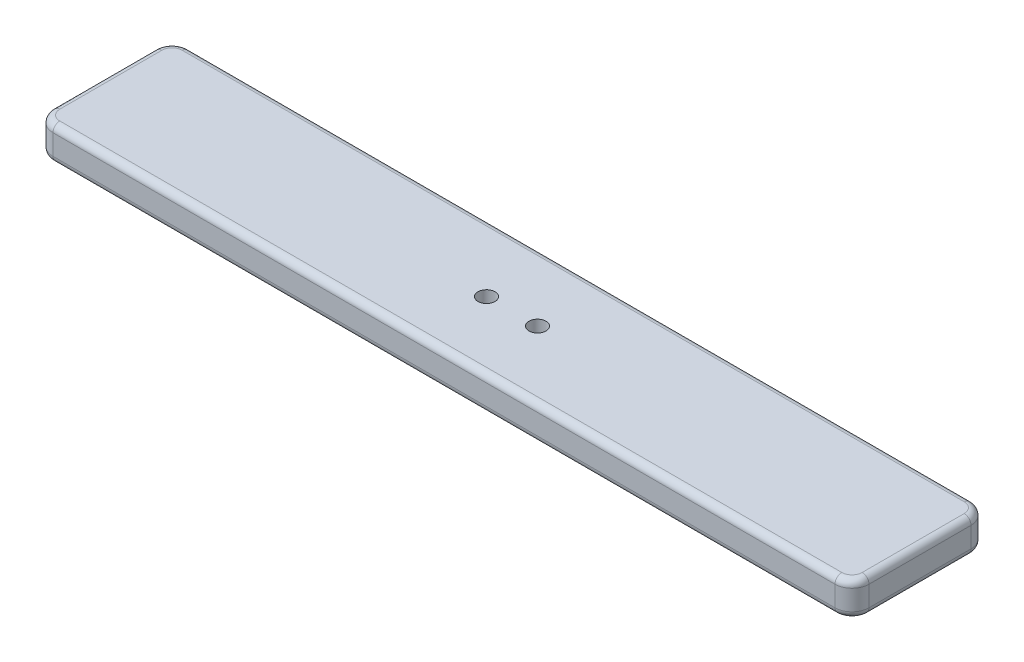
ISO-10303-21;
HEADER;
FILE_DESCRIPTION(('STEP AP214'),'2;1');
FILE_NAME('part.step','',(''),(''),'','','');
FILE_SCHEMA(('AUTOMOTIVE_DESIGN { 1 0 10303 214 1 1 1 1 }'));
ENDSEC;
DATA;
#1=APPLICATION_CONTEXT('core data for automotive mechanical design processes');
#2=APPLICATION_PROTOCOL_DEFINITION('international standard','automotive_design',2000,#1);
#3=PRODUCT_CONTEXT('',#1,'mechanical');
#4=PRODUCT('Part','Part','',(#3));
#5=PRODUCT_RELATED_PRODUCT_CATEGORY('part','',(#4));
#6=PRODUCT_DEFINITION_FORMATION('','',#4);
#7=PRODUCT_DEFINITION_CONTEXT('part definition',#1,'design');
#8=PRODUCT_DEFINITION('design','',#6,#7);
#9=PRODUCT_DEFINITION_SHAPE('','',#8);
#10=(LENGTH_UNIT() NAMED_UNIT(*) SI_UNIT(.MILLI.,.METRE.));
#11=(NAMED_UNIT(*) PLANE_ANGLE_UNIT() SI_UNIT($,.RADIAN.));
#12=(NAMED_UNIT(*) SI_UNIT($,.STERADIAN.) SOLID_ANGLE_UNIT());
#13=UNCERTAINTY_MEASURE_WITH_UNIT(LENGTH_MEASURE(1.E-05),#10,'distance_accuracy_value','');
#14=(GEOMETRIC_REPRESENTATION_CONTEXT(3) GLOBAL_UNCERTAINTY_ASSIGNED_CONTEXT((#13)) GLOBAL_UNIT_ASSIGNED_CONTEXT((#10,
#11,#12)) REPRESENTATION_CONTEXT('',''));
#15=CARTESIAN_POINT('',(0.,0.,0.));
#16=DIRECTION('',(0.,0.,1.));
#17=DIRECTION('',(1.,0.,0.));
#18=AXIS2_PLACEMENT_3D('',#15,#16,#17);
#19=CARTESIAN_POINT('',(0.,12.7,0.));
#20=DIRECTION('',(1.,0.,0.));
#21=DIRECTION('',(0.,0.,-1.));
#22=AXIS2_PLACEMENT_3D('',#19,#20,#21);
#23=PLANE('',#22);
#24=DIRECTION('',(0.,-1.,0.));
#25=VECTOR('',#24,1.);
#26=CARTESIAN_POINT('',(0.,12.7,-44.45));
#27=LINE('',#26,#25);
#28=CARTESIAN_POINT('',(0.,10.16,-44.45));
#29=VERTEX_POINT('',#28);
#30=CARTESIAN_POINT('',(0.,2.54,-44.45));
#31=VERTEX_POINT('',#30);
#32=EDGE_CURVE('E167',#29,#31,#27,.T.);
#33=ORIENTED_EDGE('',*,*,#32,.T.);
#34=DIRECTION('',(0.,0.,1.));
#35=VECTOR('',#34,1.);
#36=CARTESIAN_POINT('',(0.,2.54,-6.35));
#37=LINE('',#36,#35);
#38=CARTESIAN_POINT('',(0.,2.54,-6.35));
#39=VERTEX_POINT('',#38);
#40=EDGE_CURVE('E183',#31,#39,#37,.T.);
#41=ORIENTED_EDGE('',*,*,#40,.T.);
#42=DIRECTION('',(0.,-1.,0.));
#43=VECTOR('',#42,1.);
#44=CARTESIAN_POINT('',(0.,12.7,-6.35));
#45=LINE('',#44,#43);
#46=CARTESIAN_POINT('',(0.,10.16,-6.35));
#47=VERTEX_POINT('',#46);
#48=EDGE_CURVE('E301',#39,#47,#45,.F.);
#49=ORIENTED_EDGE('',*,*,#48,.T.);
#50=DIRECTION('',(0.,0.,1.));
#51=VECTOR('',#50,1.);
#52=CARTESIAN_POINT('',(0.,10.16,0.));
#53=LINE('',#52,#51);
#54=EDGE_CURVE('E181',#47,#29,#53,.F.);
#55=ORIENTED_EDGE('',*,*,#54,.T.);
#56=EDGE_LOOP('',(#33,#41,#49,#55));
#57=FACE_BOUND('',#56,.T.);
#58=ADVANCED_FACE('F34',(#57),#23,.F.);
#59=CARTESIAN_POINT('',(0.,12.7,0.));
#60=DIRECTION('',(0.,0.,-1.));
#61=DIRECTION('',(-1.,0.,0.));
#62=AXIS2_PLACEMENT_3D('',#59,#60,#61);
#63=PLANE('',#62);
#64=DIRECTION('',(0.,-1.,0.));
#65=VECTOR('',#64,1.);
#66=CARTESIAN_POINT('',(6.35,12.7,0.));
#67=LINE('',#66,#65);
#68=CARTESIAN_POINT('',(6.35,10.16,0.));
#69=VERTEX_POINT('',#68);
#70=CARTESIAN_POINT('',(6.35,2.54,0.));
#71=VERTEX_POINT('',#70);
#72=EDGE_CURVE('E295',#69,#71,#67,.T.);
#73=ORIENTED_EDGE('',*,*,#72,.T.);
#74=DIRECTION('',(1.,0.,0.));
#75=VECTOR('',#74,1.);
#76=CARTESIAN_POINT('',(298.45,2.54,0.));
#77=LINE('',#76,#75);
#78=CARTESIAN_POINT('',(298.45,2.54,0.));
#79=VERTEX_POINT('',#78);
#80=EDGE_CURVE('E191',#71,#79,#77,.T.);
#81=ORIENTED_EDGE('',*,*,#80,.T.);
#82=DIRECTION('',(0.,-1.,0.));
#83=VECTOR('',#82,1.);
#84=CARTESIAN_POINT('',(298.45,12.7,0.));
#85=LINE('',#84,#83);
#86=CARTESIAN_POINT('',(298.45,10.16,0.));
#87=VERTEX_POINT('',#86);
#88=EDGE_CURVE('E298',#79,#87,#85,.F.);
#89=ORIENTED_EDGE('',*,*,#88,.T.);
#90=DIRECTION('',(1.,0.,0.));
#91=VECTOR('',#90,1.);
#92=CARTESIAN_POINT('',(0.,10.16,0.));
#93=LINE('',#92,#91);
#94=EDGE_CURVE('E189',#87,#69,#93,.F.);
#95=ORIENTED_EDGE('',*,*,#94,.T.);
#96=EDGE_LOOP('',(#73,#81,#89,#95));
#97=FACE_BOUND('',#96,.T.);
#98=ADVANCED_FACE('F366',(#97),#63,.F.);
#99=CARTESIAN_POINT('',(304.8,12.7,0.));
#100=DIRECTION('',(-1.,0.,0.));
#101=DIRECTION('',(0.,0.,1.));
#102=AXIS2_PLACEMENT_3D('',#99,#100,#101);
#103=PLANE('',#102);
#104=DIRECTION('',(0.,-1.,0.));
#105=VECTOR('',#104,1.);
#106=CARTESIAN_POINT('',(304.8,12.7,-6.35));
#107=LINE('',#106,#105);
#108=CARTESIAN_POINT('',(304.8,10.16,-6.35));
#109=VERTEX_POINT('',#108);
#110=CARTESIAN_POINT('',(304.8,2.54,-6.35));
#111=VERTEX_POINT('',#110);
#112=EDGE_CURVE('E284',#109,#111,#107,.T.);
#113=ORIENTED_EDGE('',*,*,#112,.T.);
#114=DIRECTION('',(0.,0.,-1.));
#115=VECTOR('',#114,1.);
#116=CARTESIAN_POINT('',(304.8,2.54,-44.45));
#117=LINE('',#116,#115);
#118=CARTESIAN_POINT('',(304.8,2.54,-44.45));
#119=VERTEX_POINT('',#118);
#120=EDGE_CURVE('E200',#111,#119,#117,.T.);
#121=ORIENTED_EDGE('',*,*,#120,.T.);
#122=DIRECTION('',(0.,-1.,0.));
#123=VECTOR('',#122,1.);
#124=CARTESIAN_POINT('',(304.8,12.7,-44.45));
#125=LINE('',#124,#123);
#126=CARTESIAN_POINT('',(304.8,10.16,-44.45));
#127=VERTEX_POINT('',#126);
#128=EDGE_CURVE('E292',#119,#127,#125,.F.);
#129=ORIENTED_EDGE('',*,*,#128,.T.);
#130=DIRECTION('',(0.,0.,-1.));
#131=VECTOR('',#130,1.);
#132=CARTESIAN_POINT('',(304.8,10.16,0.));
#133=LINE('',#132,#131);
#134=EDGE_CURVE('E198',#127,#109,#133,.F.);
#135=ORIENTED_EDGE('',*,*,#134,.T.);
#136=EDGE_LOOP('',(#113,#121,#129,#135));
#137=FACE_BOUND('',#136,.T.);
#138=ADVANCED_FACE('F350',(#137),#103,.F.);
#139=CARTESIAN_POINT('',(0.,12.7,-50.8));
#140=DIRECTION('',(0.,0.,1.));
#141=DIRECTION('',(1.,0.,0.));
#142=AXIS2_PLACEMENT_3D('',#139,#140,#141);
#143=PLANE('',#142);
#144=DIRECTION('',(0.,-1.,0.));
#145=VECTOR('',#144,1.);
#146=CARTESIAN_POINT('',(298.45,12.7,-50.8));
#147=LINE('',#146,#145);
#148=CARTESIAN_POINT('',(298.45,10.16,-50.8));
#149=VERTEX_POINT('',#148);
#150=CARTESIAN_POINT('',(298.45,2.54,-50.8));
#151=VERTEX_POINT('',#150);
#152=EDGE_CURVE('E282',#149,#151,#147,.T.);
#153=ORIENTED_EDGE('',*,*,#152,.T.);
#154=DIRECTION('',(-1.,0.,0.));
#155=VECTOR('',#154,1.);
#156=CARTESIAN_POINT('',(6.35,2.54,-50.8));
#157=LINE('',#156,#155);
#158=CARTESIAN_POINT('',(6.35,2.54,-50.8));
#159=VERTEX_POINT('',#158);
#160=EDGE_CURVE('E208',#151,#159,#157,.T.);
#161=ORIENTED_EDGE('',*,*,#160,.T.);
#162=DIRECTION('',(0.,-1.,0.));
#163=VECTOR('',#162,1.);
#164=CARTESIAN_POINT('',(6.35,12.7,-50.8));
#165=LINE('',#164,#163);
#166=CARTESIAN_POINT('',(6.35,10.16,-50.8));
#167=VERTEX_POINT('',#166);
#168=EDGE_CURVE('E239',#159,#167,#165,.F.);
#169=ORIENTED_EDGE('',*,*,#168,.T.);
#170=DIRECTION('',(-1.,0.,0.));
#171=VECTOR('',#170,1.);
#172=CARTESIAN_POINT('',(0.,10.16,-50.8));
#173=LINE('',#172,#171);
#174=EDGE_CURVE('E206',#167,#149,#173,.F.);
#175=ORIENTED_EDGE('',*,*,#174,.T.);
#176=EDGE_LOOP('',(#153,#161,#169,#175));
#177=FACE_BOUND('',#176,.T.);
#178=ADVANCED_FACE('F280',(#177),#143,.F.);
#179=CARTESIAN_POINT('',(0.,12.7,0.));
#180=DIRECTION('',(0.,-1.,0.));
#181=DIRECTION('',(0.,0.,-1.));
#182=AXIS2_PLACEMENT_3D('',#179,#180,#181);
#183=PLANE('',#182);
#184=CARTESIAN_POINT('',(161.925,12.7,-25.4));
#185=DIRECTION('',(0.,1.,0.));
#186=DIRECTION('',(0.,0.,-1.));
#187=AXIS2_PLACEMENT_3D('',#184,#185,#186);
#188=CIRCLE('',#187,3.175);
#189=CARTESIAN_POINT('',(161.925,12.7,-28.575));
#190=VERTEX_POINT('',#189);
#191=EDGE_CURVE('E624',#190,#190,#188,.T.);
#192=ORIENTED_EDGE('',*,*,#191,.F.);
#193=EDGE_LOOP('',(#192));
#194=FACE_BOUND('',#193,.T.);
#195=CARTESIAN_POINT('',(142.875,12.7,-25.4));
#196=DIRECTION('',(0.,1.,0.));
#197=DIRECTION('',(0.,0.,1.));
#198=AXIS2_PLACEMENT_3D('',#195,#196,#197);
#199=CIRCLE('',#198,3.175);
#200=CARTESIAN_POINT('',(142.875,12.7,-22.225));
#201=VERTEX_POINT('',#200);
#202=EDGE_CURVE('E287',#201,#201,#199,.T.);
#203=ORIENTED_EDGE('',*,*,#202,.F.);
#204=EDGE_LOOP('',(#203));
#205=FACE_BOUND('',#204,.T.);
#206=DIRECTION('',(1.,0.,0.));
#207=VECTOR('',#206,1.);
#208=CARTESIAN_POINT('',(0.,12.7,-2.54));
#209=LINE('',#208,#207);
#210=CARTESIAN_POINT('',(6.35,12.7,-2.54));
#211=VERTEX_POINT('',#210);
#212=CARTESIAN_POINT('',(298.45,12.7,-2.54));
#213=VERTEX_POINT('',#212);
#214=EDGE_CURVE('E43',#211,#213,#209,.T.);
#215=ORIENTED_EDGE('',*,*,#214,.T.);
#216=CARTESIAN_POINT('',(298.45,12.7,-6.35));
#217=DIRECTION('',(0.,-1.,0.));
#218=DIRECTION('',(0.,0.,-1.));
#219=AXIS2_PLACEMENT_3D('',#216,#217,#218);
#220=CIRCLE('',#219,3.81);
#221=CARTESIAN_POINT('',(302.26,12.7,-6.35));
#222=VERTEX_POINT('',#221);
#223=EDGE_CURVE('E11',#213,#222,#220,.F.);
#224=ORIENTED_EDGE('',*,*,#223,.T.);
#225=DIRECTION('',(0.,0.,-1.));
#226=VECTOR('',#225,1.);
#227=CARTESIAN_POINT('',(302.26,12.7,0.));
#228=LINE('',#227,#226);
#229=CARTESIAN_POINT('',(302.26,12.7,-44.45));
#230=VERTEX_POINT('',#229);
#231=EDGE_CURVE('E210',#222,#230,#228,.T.);
#232=ORIENTED_EDGE('',*,*,#231,.T.);
#233=CARTESIAN_POINT('',(298.45,12.7,-44.45));
#234=DIRECTION('',(0.,-1.,0.));
#235=DIRECTION('',(0.,0.,-1.));
#236=AXIS2_PLACEMENT_3D('',#233,#234,#235);
#237=CIRCLE('',#236,3.81);
#238=CARTESIAN_POINT('',(298.45,12.7,-48.26));
#239=VERTEX_POINT('',#238);
#240=EDGE_CURVE('E212',#230,#239,#237,.F.);
#241=ORIENTED_EDGE('',*,*,#240,.T.);
#242=DIRECTION('',(-1.,0.,0.));
#243=VECTOR('',#242,1.);
#244=CARTESIAN_POINT('',(0.,12.7,-48.26));
#245=LINE('',#244,#243);
#246=CARTESIAN_POINT('',(6.35,12.7,-48.26));
#247=VERTEX_POINT('',#246);
#248=EDGE_CURVE('E214',#239,#247,#245,.T.);
#249=ORIENTED_EDGE('',*,*,#248,.T.);
#250=CARTESIAN_POINT('',(6.35,12.7,-44.45));
#251=DIRECTION('',(0.,-1.,0.));
#252=DIRECTION('',(0.,0.,-1.));
#253=AXIS2_PLACEMENT_3D('',#250,#251,#252);
#254=CIRCLE('',#253,3.81);
#255=CARTESIAN_POINT('',(2.54,12.7,-44.45));
#256=VERTEX_POINT('',#255);
#257=EDGE_CURVE('E216',#247,#256,#254,.F.);
#258=ORIENTED_EDGE('',*,*,#257,.T.);
#259=DIRECTION('',(0.,0.,1.));
#260=VECTOR('',#259,1.);
#261=CARTESIAN_POINT('',(2.54,12.7,0.));
#262=LINE('',#261,#260);
#263=CARTESIAN_POINT('',(2.54,12.7,-6.35));
#264=VERTEX_POINT('',#263);
#265=EDGE_CURVE('E218',#256,#264,#262,.T.);
#266=ORIENTED_EDGE('',*,*,#265,.T.);
#267=CARTESIAN_POINT('',(6.35,12.7,-6.35));
#268=DIRECTION('',(0.,-1.,0.));
#269=DIRECTION('',(0.,0.,-1.));
#270=AXIS2_PLACEMENT_3D('',#267,#268,#269);
#271=CIRCLE('',#270,3.81);
#272=EDGE_CURVE('E54',#264,#211,#271,.F.);
#273=ORIENTED_EDGE('',*,*,#272,.T.);
#274=EDGE_LOOP('',(#215,#224,#232,#241,#249,#258,#266,#273));
#275=FACE_BOUND('',#274,.T.);
#276=ADVANCED_FACE('F338',(#194,#205,#275),#183,.F.);
#277=CARTESIAN_POINT('',(0.,0.,0.));
#278=DIRECTION('',(0.,-1.,0.));
#279=DIRECTION('',(0.,0.,-1.));
#280=AXIS2_PLACEMENT_3D('',#277,#278,#279);
#281=PLANE('',#280);
#282=CARTESIAN_POINT('',(161.925,0.,-25.4));
#283=DIRECTION('',(0.,1.,0.));
#284=DIRECTION('',(0.,0.,-1.));
#285=AXIS2_PLACEMENT_3D('',#282,#283,#284);
#286=CIRCLE('',#285,3.175);
#287=CARTESIAN_POINT('',(161.925,0.,-28.575));
#288=VERTEX_POINT('',#287);
#289=EDGE_CURVE('E621',#288,#288,#286,.T.);
#290=ORIENTED_EDGE('',*,*,#289,.T.);
#291=EDGE_LOOP('',(#290));
#292=FACE_BOUND('',#291,.T.);
#293=CARTESIAN_POINT('',(142.875,0.,-25.4));
#294=DIRECTION('',(0.,1.,0.));
#295=DIRECTION('',(0.,0.,1.));
#296=AXIS2_PLACEMENT_3D('',#293,#294,#295);
#297=CIRCLE('',#296,3.175);
#298=CARTESIAN_POINT('',(142.875,0.,-22.225));
#299=VERTEX_POINT('',#298);
#300=EDGE_CURVE('E243',#299,#299,#297,.T.);
#301=ORIENTED_EDGE('',*,*,#300,.T.);
#302=EDGE_LOOP('',(#301));
#303=FACE_BOUND('',#302,.T.);
#304=DIRECTION('',(0.,0.,1.));
#305=VECTOR('',#304,1.);
#306=CARTESIAN_POINT('',(2.54,0.,-44.45));
#307=LINE('',#306,#305);
#308=CARTESIAN_POINT('',(2.54,0.,-6.35));
#309=VERTEX_POINT('',#308);
#310=CARTESIAN_POINT('',(2.54,0.,-44.45));
#311=VERTEX_POINT('',#310);
#312=EDGE_CURVE('E171',#309,#311,#307,.F.);
#313=ORIENTED_EDGE('',*,*,#312,.T.);
#314=CARTESIAN_POINT('',(6.35,0.,-44.45));
#315=DIRECTION('',(0.,-1.,0.));
#316=DIRECTION('',(0.,0.,-1.));
#317=AXIS2_PLACEMENT_3D('',#314,#315,#316);
#318=CIRCLE('',#317,3.81);
#319=CARTESIAN_POINT('',(6.35,0.,-48.26));
#320=VERTEX_POINT('',#319);
#321=EDGE_CURVE('E152',#311,#320,#318,.T.);
#322=ORIENTED_EDGE('',*,*,#321,.T.);
#323=DIRECTION('',(-1.,0.,0.));
#324=VECTOR('',#323,1.);
#325=CARTESIAN_POINT('',(298.45,0.,-48.26));
#326=LINE('',#325,#324);
#327=CARTESIAN_POINT('',(298.45,0.,-48.26));
#328=VERTEX_POINT('',#327);
#329=EDGE_CURVE('E160',#320,#328,#326,.F.);
#330=ORIENTED_EDGE('',*,*,#329,.T.);
#331=CARTESIAN_POINT('',(298.45,0.,-44.45));
#332=DIRECTION('',(0.,-1.,0.));
#333=DIRECTION('',(0.,0.,-1.));
#334=AXIS2_PLACEMENT_3D('',#331,#332,#333);
#335=CIRCLE('',#334,3.81);
#336=CARTESIAN_POINT('',(302.26,0.,-44.45));
#337=VERTEX_POINT('',#336);
#338=EDGE_CURVE('E166',#328,#337,#335,.T.);
#339=ORIENTED_EDGE('',*,*,#338,.T.);
#340=DIRECTION('',(0.,0.,-1.));
#341=VECTOR('',#340,1.);
#342=CARTESIAN_POINT('',(302.26,0.,-6.35));
#343=LINE('',#342,#341);
#344=CARTESIAN_POINT('',(302.26,0.,-6.35));
#345=VERTEX_POINT('',#344);
#346=EDGE_CURVE('E306',#337,#345,#343,.F.);
#347=ORIENTED_EDGE('',*,*,#346,.T.);
#348=CARTESIAN_POINT('',(298.45,0.,-6.35));
#349=DIRECTION('',(0.,-1.,0.));
#350=DIRECTION('',(0.,0.,-1.));
#351=AXIS2_PLACEMENT_3D('',#348,#349,#350);
#352=CIRCLE('',#351,3.81);
#353=CARTESIAN_POINT('',(298.45,0.,-2.54));
#354=VERTEX_POINT('',#353);
#355=EDGE_CURVE('E308',#345,#354,#352,.T.);
#356=ORIENTED_EDGE('',*,*,#355,.T.);
#357=DIRECTION('',(1.,0.,0.));
#358=VECTOR('',#357,1.);
#359=CARTESIAN_POINT('',(6.35,0.,-2.54));
#360=LINE('',#359,#358);
#361=CARTESIAN_POINT('',(6.35,0.,-2.54));
#362=VERTEX_POINT('',#361);
#363=EDGE_CURVE('E310',#354,#362,#360,.F.);
#364=ORIENTED_EDGE('',*,*,#363,.T.);
#365=CARTESIAN_POINT('',(6.35,0.,-6.35));
#366=DIRECTION('',(0.,-1.,0.));
#367=DIRECTION('',(0.,0.,-1.));
#368=AXIS2_PLACEMENT_3D('',#365,#366,#367);
#369=CIRCLE('',#368,3.81);
#370=EDGE_CURVE('E176',#362,#309,#369,.T.);
#371=ORIENTED_EDGE('',*,*,#370,.T.);
#372=EDGE_LOOP('',(#313,#322,#330,#339,#347,#356,#364,#371));
#373=FACE_BOUND('',#372,.T.);
#374=ADVANCED_FACE('F169',(#292,#303,#373),#281,.T.);
#375=CARTESIAN_POINT('',(298.45,12.7,-44.45));
#376=DIRECTION('',(0.,-1.,0.));
#377=DIRECTION('',(0.,0.,-1.));
#378=AXIS2_PLACEMENT_3D('',#375,#376,#377);
#379=CYLINDRICAL_SURFACE('',#378,6.35);
#380=ORIENTED_EDGE('',*,*,#128,.F.);
#381=CARTESIAN_POINT('',(298.45,2.54,-44.45));
#382=DIRECTION('',(0.,-1.,0.));
#383=DIRECTION('',(0.,0.,-1.));
#384=AXIS2_PLACEMENT_3D('',#381,#382,#383);
#385=CIRCLE('',#384,6.35);
#386=EDGE_CURVE('E204',#119,#151,#385,.F.);
#387=ORIENTED_EDGE('',*,*,#386,.T.);
#388=ORIENTED_EDGE('',*,*,#152,.F.);
#389=CARTESIAN_POINT('',(298.45,10.16,-44.45));
#390=DIRECTION('',(0.,-1.,0.));
#391=DIRECTION('',(0.,0.,-1.));
#392=AXIS2_PLACEMENT_3D('',#389,#390,#391);
#393=CIRCLE('',#392,6.35);
#394=EDGE_CURVE('E202',#149,#127,#393,.T.);
#395=ORIENTED_EDGE('',*,*,#394,.T.);
#396=EDGE_LOOP('',(#380,#387,#388,#395));
#397=FACE_BOUND('',#396,.T.);
#398=ADVANCED_FACE('F377',(#397),#379,.T.);
#399=CARTESIAN_POINT('',(298.45,12.7,-6.35));
#400=DIRECTION('',(0.,-1.,0.));
#401=DIRECTION('',(0.,0.,-1.));
#402=AXIS2_PLACEMENT_3D('',#399,#400,#401);
#403=CYLINDRICAL_SURFACE('',#402,6.35);
#404=ORIENTED_EDGE('',*,*,#88,.F.);
#405=CARTESIAN_POINT('',(298.45,2.54,-6.35));
#406=DIRECTION('',(0.,-1.,0.));
#407=DIRECTION('',(0.,0.,-1.));
#408=AXIS2_PLACEMENT_3D('',#405,#406,#407);
#409=CIRCLE('',#408,6.35);
#410=EDGE_CURVE('E196',#79,#111,#409,.F.);
#411=ORIENTED_EDGE('',*,*,#410,.T.);
#412=ORIENTED_EDGE('',*,*,#112,.F.);
#413=CARTESIAN_POINT('',(298.45,10.16,-6.35));
#414=DIRECTION('',(0.,-1.,0.));
#415=DIRECTION('',(0.,0.,-1.));
#416=AXIS2_PLACEMENT_3D('',#413,#414,#415);
#417=CIRCLE('',#416,6.35);
#418=EDGE_CURVE('E193',#109,#87,#417,.T.);
#419=ORIENTED_EDGE('',*,*,#418,.T.);
#420=EDGE_LOOP('',(#404,#411,#412,#419));
#421=FACE_BOUND('',#420,.T.);
#422=ADVANCED_FACE('F355',(#421),#403,.T.);
#423=CARTESIAN_POINT('',(6.35,12.7,-44.45));
#424=DIRECTION('',(0.,-1.,0.));
#425=DIRECTION('',(0.,0.,-1.));
#426=AXIS2_PLACEMENT_3D('',#423,#424,#425);
#427=CYLINDRICAL_SURFACE('',#426,6.35);
#428=ORIENTED_EDGE('',*,*,#168,.F.);
#429=CARTESIAN_POINT('',(6.35,2.54,-44.45));
#430=DIRECTION('',(0.,-1.,0.));
#431=DIRECTION('',(0.,0.,-1.));
#432=AXIS2_PLACEMENT_3D('',#429,#430,#431);
#433=CIRCLE('',#432,6.35);
#434=EDGE_CURVE('E154',#159,#31,#433,.F.);
#435=ORIENTED_EDGE('',*,*,#434,.T.);
#436=ORIENTED_EDGE('',*,*,#32,.F.);
#437=CARTESIAN_POINT('',(6.35,10.16,-44.45));
#438=DIRECTION('',(0.,-1.,0.));
#439=DIRECTION('',(0.,0.,-1.));
#440=AXIS2_PLACEMENT_3D('',#437,#438,#439);
#441=CIRCLE('',#440,6.35);
#442=EDGE_CURVE('E173',#29,#167,#441,.T.);
#443=ORIENTED_EDGE('',*,*,#442,.T.);
#444=EDGE_LOOP('',(#428,#435,#436,#443));
#445=FACE_BOUND('',#444,.T.);
#446=ADVANCED_FACE('F276',(#445),#427,.T.);
#447=CARTESIAN_POINT('',(6.35,12.7,-6.35));
#448=DIRECTION('',(0.,-1.,0.));
#449=DIRECTION('',(0.,0.,-1.));
#450=AXIS2_PLACEMENT_3D('',#447,#448,#449);
#451=CYLINDRICAL_SURFACE('',#450,6.35);
#452=ORIENTED_EDGE('',*,*,#48,.F.);
#453=CARTESIAN_POINT('',(6.35,2.54,-6.35));
#454=DIRECTION('',(0.,-1.,0.));
#455=DIRECTION('',(0.,0.,-1.));
#456=AXIS2_PLACEMENT_3D('',#453,#454,#455);
#457=CIRCLE('',#456,6.35);
#458=EDGE_CURVE('E187',#39,#71,#457,.F.);
#459=ORIENTED_EDGE('',*,*,#458,.T.);
#460=ORIENTED_EDGE('',*,*,#72,.F.);
#461=CARTESIAN_POINT('',(6.35,10.16,-6.35));
#462=DIRECTION('',(0.,-1.,0.));
#463=DIRECTION('',(0.,0.,-1.));
#464=AXIS2_PLACEMENT_3D('',#461,#462,#463);
#465=CIRCLE('',#464,6.35);
#466=EDGE_CURVE('E185',#69,#47,#465,.T.);
#467=ORIENTED_EDGE('',*,*,#466,.T.);
#468=EDGE_LOOP('',(#452,#459,#460,#467));
#469=FACE_BOUND('',#468,.T.);
#470=ADVANCED_FACE('F324',(#469),#451,.T.);
#471=CARTESIAN_POINT('',(298.45,2.54,-6.35));
#472=DIRECTION('',(0.,-1.,0.));
#473=DIRECTION('',(0.,0.,-1.));
#474=AXIS2_PLACEMENT_3D('',#471,#472,#473);
#475=TOROIDAL_SURFACE('',#474,3.81,2.54);
#476=CARTESIAN_POINT('',(302.26,2.54,-6.35));
#477=DIRECTION('',(0.,0.,-1.));
#478=DIRECTION('',(-1.,0.,0.));
#479=AXIS2_PLACEMENT_3D('',#476,#477,#478);
#480=CIRCLE('',#479,2.54);
#481=EDGE_CURVE('E233',#111,#345,#480,.T.);
#482=ORIENTED_EDGE('',*,*,#481,.F.);
#483=ORIENTED_EDGE('',*,*,#410,.F.);
#484=CARTESIAN_POINT('',(298.45,2.54,-2.54));
#485=DIRECTION('',(-1.,0.,0.));
#486=DIRECTION('',(0.,0.,1.));
#487=AXIS2_PLACEMENT_3D('',#484,#485,#486);
#488=CIRCLE('',#487,2.54);
#489=EDGE_CURVE('E236',#354,#79,#488,.T.);
#490=ORIENTED_EDGE('',*,*,#489,.F.);
#491=ORIENTED_EDGE('',*,*,#355,.F.);
#492=EDGE_LOOP('',(#482,#483,#490,#491));
#493=FACE_BOUND('',#492,.T.);
#494=ADVANCED_FACE('F359',(#493),#475,.T.);
#495=CARTESIAN_POINT('',(0.,2.54,-2.54));
#496=DIRECTION('',(-1.,0.,0.));
#497=DIRECTION('',(0.,0.,1.));
#498=AXIS2_PLACEMENT_3D('',#495,#496,#497);
#499=CYLINDRICAL_SURFACE('',#498,2.54);
#500=ORIENTED_EDGE('',*,*,#489,.T.);
#501=ORIENTED_EDGE('',*,*,#80,.F.);
#502=CARTESIAN_POINT('',(6.35,2.54,-2.54));
#503=DIRECTION('',(-1.,0.,0.));
#504=DIRECTION('',(0.,0.,1.));
#505=AXIS2_PLACEMENT_3D('',#502,#503,#504);
#506=CIRCLE('',#505,2.54);
#507=EDGE_CURVE('E230',#362,#71,#506,.T.);
#508=ORIENTED_EDGE('',*,*,#507,.F.);
#509=ORIENTED_EDGE('',*,*,#363,.F.);
#510=EDGE_LOOP('',(#500,#501,#508,#509));
#511=FACE_BOUND('',#510,.T.);
#512=ADVANCED_FACE('F364',(#511),#499,.T.);
#513=CARTESIAN_POINT('',(302.26,2.54,0.));
#514=DIRECTION('',(0.,0.,1.));
#515=DIRECTION('',(1.,0.,0.));
#516=AXIS2_PLACEMENT_3D('',#513,#514,#515);
#517=CYLINDRICAL_SURFACE('',#516,2.54);
#518=ORIENTED_EDGE('',*,*,#481,.T.);
#519=ORIENTED_EDGE('',*,*,#346,.F.);
#520=CARTESIAN_POINT('',(302.26,2.54,-44.45));
#521=DIRECTION('',(0.,0.,-1.));
#522=DIRECTION('',(-1.,0.,0.));
#523=AXIS2_PLACEMENT_3D('',#520,#521,#522);
#524=CIRCLE('',#523,2.54);
#525=EDGE_CURVE('E227',#119,#337,#524,.T.);
#526=ORIENTED_EDGE('',*,*,#525,.F.);
#527=ORIENTED_EDGE('',*,*,#120,.F.);
#528=EDGE_LOOP('',(#518,#519,#526,#527));
#529=FACE_BOUND('',#528,.T.);
#530=ADVANCED_FACE('F399',(#529),#517,.T.);
#531=CARTESIAN_POINT('',(6.35,2.54,-6.35));
#532=DIRECTION('',(0.,-1.,0.));
#533=DIRECTION('',(0.,0.,-1.));
#534=AXIS2_PLACEMENT_3D('',#531,#532,#533);
#535=TOROIDAL_SURFACE('',#534,3.81,2.54);
#536=ORIENTED_EDGE('',*,*,#507,.T.);
#537=ORIENTED_EDGE('',*,*,#458,.F.);
#538=CARTESIAN_POINT('',(2.54,2.54,-6.35));
#539=DIRECTION('',(0.,0.,-1.));
#540=DIRECTION('',(-1.,0.,0.));
#541=AXIS2_PLACEMENT_3D('',#538,#539,#540);
#542=CIRCLE('',#541,2.54);
#543=EDGE_CURVE('E224',#309,#39,#542,.T.);
#544=ORIENTED_EDGE('',*,*,#543,.F.);
#545=ORIENTED_EDGE('',*,*,#370,.F.);
#546=EDGE_LOOP('',(#536,#537,#544,#545));
#547=FACE_BOUND('',#546,.T.);
#548=ADVANCED_FACE('F317',(#547),#535,.T.);
#549=CARTESIAN_POINT('',(298.45,2.54,-44.45));
#550=DIRECTION('',(0.,-1.,0.));
#551=DIRECTION('',(0.,0.,-1.));
#552=AXIS2_PLACEMENT_3D('',#549,#550,#551);
#553=TOROIDAL_SURFACE('',#552,3.81,2.54);
#554=ORIENTED_EDGE('',*,*,#525,.T.);
#555=ORIENTED_EDGE('',*,*,#338,.F.);
#556=CARTESIAN_POINT('',(298.45,2.54,-48.26));
#557=DIRECTION('',(-1.,0.,0.));
#558=DIRECTION('',(0.,0.,1.));
#559=AXIS2_PLACEMENT_3D('',#556,#557,#558);
#560=CIRCLE('',#559,2.54);
#561=EDGE_CURVE('E163',#151,#328,#560,.T.);
#562=ORIENTED_EDGE('',*,*,#561,.F.);
#563=ORIENTED_EDGE('',*,*,#386,.F.);
#564=EDGE_LOOP('',(#554,#555,#562,#563));
#565=FACE_BOUND('',#564,.T.);
#566=ADVANCED_FACE('F393',(#565),#553,.T.);
#567=CARTESIAN_POINT('',(2.54,2.54,0.));
#568=DIRECTION('',(0.,0.,-1.));
#569=DIRECTION('',(-1.,0.,0.));
#570=AXIS2_PLACEMENT_3D('',#567,#568,#569);
#571=CYLINDRICAL_SURFACE('',#570,2.54);
#572=ORIENTED_EDGE('',*,*,#543,.T.);
#573=ORIENTED_EDGE('',*,*,#40,.F.);
#574=CARTESIAN_POINT('',(2.54,2.54,-44.45));
#575=DIRECTION('',(0.,0.,-1.));
#576=DIRECTION('',(-1.,0.,0.));
#577=AXIS2_PLACEMENT_3D('',#574,#575,#576);
#578=CIRCLE('',#577,2.54);
#579=EDGE_CURVE('E157',#311,#31,#578,.T.);
#580=ORIENTED_EDGE('',*,*,#579,.F.);
#581=ORIENTED_EDGE('',*,*,#312,.F.);
#582=EDGE_LOOP('',(#572,#573,#580,#581));
#583=FACE_BOUND('',#582,.T.);
#584=ADVANCED_FACE('F320',(#583),#571,.T.);
#585=CARTESIAN_POINT('',(0.,2.54,-48.26));
#586=DIRECTION('',(1.,0.,0.));
#587=DIRECTION('',(0.,0.,-1.));
#588=AXIS2_PLACEMENT_3D('',#585,#586,#587);
#589=CYLINDRICAL_SURFACE('',#588,2.54);
#590=ORIENTED_EDGE('',*,*,#561,.T.);
#591=ORIENTED_EDGE('',*,*,#329,.F.);
#592=CARTESIAN_POINT('',(6.35,2.54,-48.26));
#593=DIRECTION('',(-1.,0.,0.));
#594=DIRECTION('',(0.,0.,1.));
#595=AXIS2_PLACEMENT_3D('',#592,#593,#594);
#596=CIRCLE('',#595,2.54);
#597=EDGE_CURVE('E148',#159,#320,#596,.T.);
#598=ORIENTED_EDGE('',*,*,#597,.F.);
#599=ORIENTED_EDGE('',*,*,#160,.F.);
#600=EDGE_LOOP('',(#590,#591,#598,#599));
#601=FACE_BOUND('',#600,.T.);
#602=ADVANCED_FACE('F161',(#601),#589,.T.);
#603=CARTESIAN_POINT('',(6.35,2.54,-44.45));
#604=DIRECTION('',(0.,-1.,0.));
#605=DIRECTION('',(0.,0.,-1.));
#606=AXIS2_PLACEMENT_3D('',#603,#604,#605);
#607=TOROIDAL_SURFACE('',#606,3.81,2.54);
#608=ORIENTED_EDGE('',*,*,#579,.T.);
#609=ORIENTED_EDGE('',*,*,#434,.F.);
#610=ORIENTED_EDGE('',*,*,#597,.T.);
#611=ORIENTED_EDGE('',*,*,#321,.F.);
#612=EDGE_LOOP('',(#608,#609,#610,#611));
#613=FACE_BOUND('',#612,.T.);
#614=ADVANCED_FACE('F150',(#613),#607,.T.);
#615=CARTESIAN_POINT('',(6.35,10.16,-44.45));
#616=DIRECTION('',(0.,-1.,0.));
#617=DIRECTION('',(0.,0.,-1.));
#618=AXIS2_PLACEMENT_3D('',#615,#616,#617);
#619=TOROIDAL_SURFACE('',#618,3.81,2.54);
#620=CARTESIAN_POINT('',(6.35,10.16,-48.26));
#621=DIRECTION('',(1.,0.,0.));
#622=DIRECTION('',(0.,0.,-1.));
#623=AXIS2_PLACEMENT_3D('',#620,#621,#622);
#624=CIRCLE('',#623,2.54);
#625=EDGE_CURVE('E256',#167,#247,#624,.T.);
#626=ORIENTED_EDGE('',*,*,#625,.F.);
#627=ORIENTED_EDGE('',*,*,#442,.F.);
#628=CARTESIAN_POINT('',(2.54,10.16,-44.45));
#629=DIRECTION('',(0.,0.,1.));
#630=DIRECTION('',(1.,0.,0.));
#631=AXIS2_PLACEMENT_3D('',#628,#629,#630);
#632=CIRCLE('',#631,2.54);
#633=EDGE_CURVE('E38',#256,#29,#632,.T.);
#634=ORIENTED_EDGE('',*,*,#633,.F.);
#635=ORIENTED_EDGE('',*,*,#257,.F.);
#636=EDGE_LOOP('',(#626,#627,#634,#635));
#637=FACE_BOUND('',#636,.T.);
#638=ADVANCED_FACE('F36',(#637),#619,.T.);
#639=CARTESIAN_POINT('',(2.54,10.16,0.));
#640=DIRECTION('',(0.,0.,1.));
#641=DIRECTION('',(1.,0.,0.));
#642=AXIS2_PLACEMENT_3D('',#639,#640,#641);
#643=CYLINDRICAL_SURFACE('',#642,2.54);
#644=ORIENTED_EDGE('',*,*,#633,.T.);
#645=ORIENTED_EDGE('',*,*,#54,.F.);
#646=CARTESIAN_POINT('',(2.54,10.16,-6.35));
#647=DIRECTION('',(0.,0.,1.));
#648=DIRECTION('',(1.,0.,0.));
#649=AXIS2_PLACEMENT_3D('',#646,#647,#648);
#650=CIRCLE('',#649,2.54);
#651=EDGE_CURVE('E254',#264,#47,#650,.T.);
#652=ORIENTED_EDGE('',*,*,#651,.F.);
#653=ORIENTED_EDGE('',*,*,#265,.F.);
#654=EDGE_LOOP('',(#644,#645,#652,#653));
#655=FACE_BOUND('',#654,.T.);
#656=ADVANCED_FACE('F267',(#655),#643,.T.);
#657=CARTESIAN_POINT('',(0.,10.16,-48.26));
#658=DIRECTION('',(-1.,0.,0.));
#659=DIRECTION('',(0.,0.,1.));
#660=AXIS2_PLACEMENT_3D('',#657,#658,#659);
#661=CYLINDRICAL_SURFACE('',#660,2.54);
#662=ORIENTED_EDGE('',*,*,#625,.T.);
#663=ORIENTED_EDGE('',*,*,#248,.F.);
#664=CARTESIAN_POINT('',(298.45,10.16,-48.26));
#665=DIRECTION('',(1.,0.,0.));
#666=DIRECTION('',(0.,0.,-1.));
#667=AXIS2_PLACEMENT_3D('',#664,#665,#666);
#668=CIRCLE('',#667,2.54);
#669=EDGE_CURVE('E251',#149,#239,#668,.T.);
#670=ORIENTED_EDGE('',*,*,#669,.F.);
#671=ORIENTED_EDGE('',*,*,#174,.F.);
#672=EDGE_LOOP('',(#662,#663,#670,#671));
#673=FACE_BOUND('',#672,.T.);
#674=ADVANCED_FACE('F418',(#673),#661,.T.);
#675=CARTESIAN_POINT('',(6.35,10.16,-6.35));
#676=DIRECTION('',(0.,-1.,0.));
#677=DIRECTION('',(0.,0.,-1.));
#678=AXIS2_PLACEMENT_3D('',#675,#676,#677);
#679=TOROIDAL_SURFACE('',#678,3.81,2.54);
#680=ORIENTED_EDGE('',*,*,#651,.T.);
#681=ORIENTED_EDGE('',*,*,#466,.F.);
#682=CARTESIAN_POINT('',(6.35,10.16,-2.54));
#683=DIRECTION('',(1.,0.,0.));
#684=DIRECTION('',(0.,0.,-1.));
#685=AXIS2_PLACEMENT_3D('',#682,#683,#684);
#686=CIRCLE('',#685,2.54);
#687=EDGE_CURVE('E248',#211,#69,#686,.T.);
#688=ORIENTED_EDGE('',*,*,#687,.F.);
#689=ORIENTED_EDGE('',*,*,#272,.F.);
#690=EDGE_LOOP('',(#680,#681,#688,#689));
#691=FACE_BOUND('',#690,.T.);
#692=ADVANCED_FACE('F328',(#691),#679,.T.);
#693=CARTESIAN_POINT('',(298.45,10.16,-44.45));
#694=DIRECTION('',(0.,-1.,0.));
#695=DIRECTION('',(0.,0.,-1.));
#696=AXIS2_PLACEMENT_3D('',#693,#694,#695);
#697=TOROIDAL_SURFACE('',#696,3.81,2.54);
#698=ORIENTED_EDGE('',*,*,#669,.T.);
#699=ORIENTED_EDGE('',*,*,#240,.F.);
#700=CARTESIAN_POINT('',(302.26,10.16,-44.45));
#701=DIRECTION('',(0.,0.,1.));
#702=DIRECTION('',(1.,0.,0.));
#703=AXIS2_PLACEMENT_3D('',#700,#701,#702);
#704=CIRCLE('',#703,2.54);
#705=EDGE_CURVE('E245',#127,#230,#704,.T.);
#706=ORIENTED_EDGE('',*,*,#705,.F.);
#707=ORIENTED_EDGE('',*,*,#394,.F.);
#708=EDGE_LOOP('',(#698,#699,#706,#707));
#709=FACE_BOUND('',#708,.T.);
#710=ADVANCED_FACE('F343',(#709),#697,.T.);
#711=CARTESIAN_POINT('',(0.,10.16,-2.54));
#712=DIRECTION('',(1.,0.,0.));
#713=DIRECTION('',(0.,0.,-1.));
#714=AXIS2_PLACEMENT_3D('',#711,#712,#713);
#715=CYLINDRICAL_SURFACE('',#714,2.54);
#716=ORIENTED_EDGE('',*,*,#687,.T.);
#717=ORIENTED_EDGE('',*,*,#94,.F.);
#718=CARTESIAN_POINT('',(298.45,10.16,-2.54));
#719=DIRECTION('',(1.,0.,0.));
#720=DIRECTION('',(0.,0.,-1.));
#721=AXIS2_PLACEMENT_3D('',#718,#719,#720);
#722=CIRCLE('',#721,2.54);
#723=EDGE_CURVE('E242',#213,#87,#722,.T.);
#724=ORIENTED_EDGE('',*,*,#723,.F.);
#725=ORIENTED_EDGE('',*,*,#214,.F.);
#726=EDGE_LOOP('',(#716,#717,#724,#725));
#727=FACE_BOUND('',#726,.T.);
#728=ADVANCED_FACE('F331',(#727),#715,.T.);
#729=CARTESIAN_POINT('',(302.26,10.16,0.));
#730=DIRECTION('',(0.,0.,-1.));
#731=DIRECTION('',(-1.,0.,0.));
#732=AXIS2_PLACEMENT_3D('',#729,#730,#731);
#733=CYLINDRICAL_SURFACE('',#732,2.54);
#734=ORIENTED_EDGE('',*,*,#705,.T.);
#735=ORIENTED_EDGE('',*,*,#231,.F.);
#736=CARTESIAN_POINT('',(302.26,10.16,-6.35));
#737=DIRECTION('',(0.,0.,1.));
#738=DIRECTION('',(1.,0.,0.));
#739=AXIS2_PLACEMENT_3D('',#736,#737,#738);
#740=CIRCLE('',#739,2.54);
#741=EDGE_CURVE('E240',#109,#222,#740,.T.);
#742=ORIENTED_EDGE('',*,*,#741,.F.);
#743=ORIENTED_EDGE('',*,*,#134,.F.);
#744=EDGE_LOOP('',(#734,#735,#742,#743));
#745=FACE_BOUND('',#744,.T.);
#746=ADVANCED_FACE('F347',(#745),#733,.T.);
#747=CARTESIAN_POINT('',(298.45,10.16,-6.35));
#748=DIRECTION('',(0.,-1.,0.));
#749=DIRECTION('',(0.,0.,-1.));
#750=AXIS2_PLACEMENT_3D('',#747,#748,#749);
#751=TOROIDAL_SURFACE('',#750,3.81,2.54);
#752=ORIENTED_EDGE('',*,*,#723,.T.);
#753=ORIENTED_EDGE('',*,*,#418,.F.);
#754=ORIENTED_EDGE('',*,*,#741,.T.);
#755=ORIENTED_EDGE('',*,*,#223,.F.);
#756=EDGE_LOOP('',(#752,#753,#754,#755));
#757=FACE_BOUND('',#756,.T.);
#758=ADVANCED_FACE('F335',(#757),#751,.T.);
#759=CARTESIAN_POINT('',(142.875,0.,-25.4));
#760=DIRECTION('',(0.,1.,0.));
#761=DIRECTION('',(0.,0.,1.));
#762=AXIS2_PLACEMENT_3D('',#759,#760,#761);
#763=CYLINDRICAL_SURFACE('',#762,3.175);
#764=ORIENTED_EDGE('',*,*,#300,.F.);
#765=EDGE_LOOP('',(#764));
#766=FACE_BOUND('',#765,.T.);
#767=ORIENTED_EDGE('',*,*,#202,.T.);
#768=EDGE_LOOP('',(#767));
#769=FACE_BOUND('',#768,.T.);
#770=ADVANCED_FACE('F409',(#766,#769),#763,.F.);
#771=CARTESIAN_POINT('',(161.925,0.,-25.4));
#772=DIRECTION('',(0.,1.,0.));
#773=DIRECTION('',(0.,0.,1.));
#774=AXIS2_PLACEMENT_3D('',#771,#772,#773);
#775=CYLINDRICAL_SURFACE('',#774,3.175);
#776=ORIENTED_EDGE('',*,*,#289,.F.);
#777=EDGE_LOOP('',(#776));
#778=FACE_BOUND('',#777,.T.);
#779=ORIENTED_EDGE('',*,*,#191,.T.);
#780=EDGE_LOOP('',(#779));
#781=FACE_BOUND('',#780,.T.);
#782=ADVANCED_FACE('F599',(#778,#781),#775,.F.);
#783=CLOSED_SHELL('',(#58,#98,#138,#178,#276,#374,#398,#422,#446,#470,#494,#512,#530,#548,#566,
#584,#602,#614,#638,#656,#674,#692,#710,#728,#746,#758,#770,#782));
#784=MANIFOLD_SOLID_BREP('B2',#783);
#785=ADVANCED_BREP_SHAPE_REPRESENTATION('',(#18,#784),#14);
#786=SHAPE_DEFINITION_REPRESENTATION(#9,#785);
ENDSEC;
END-ISO-10303-21;
